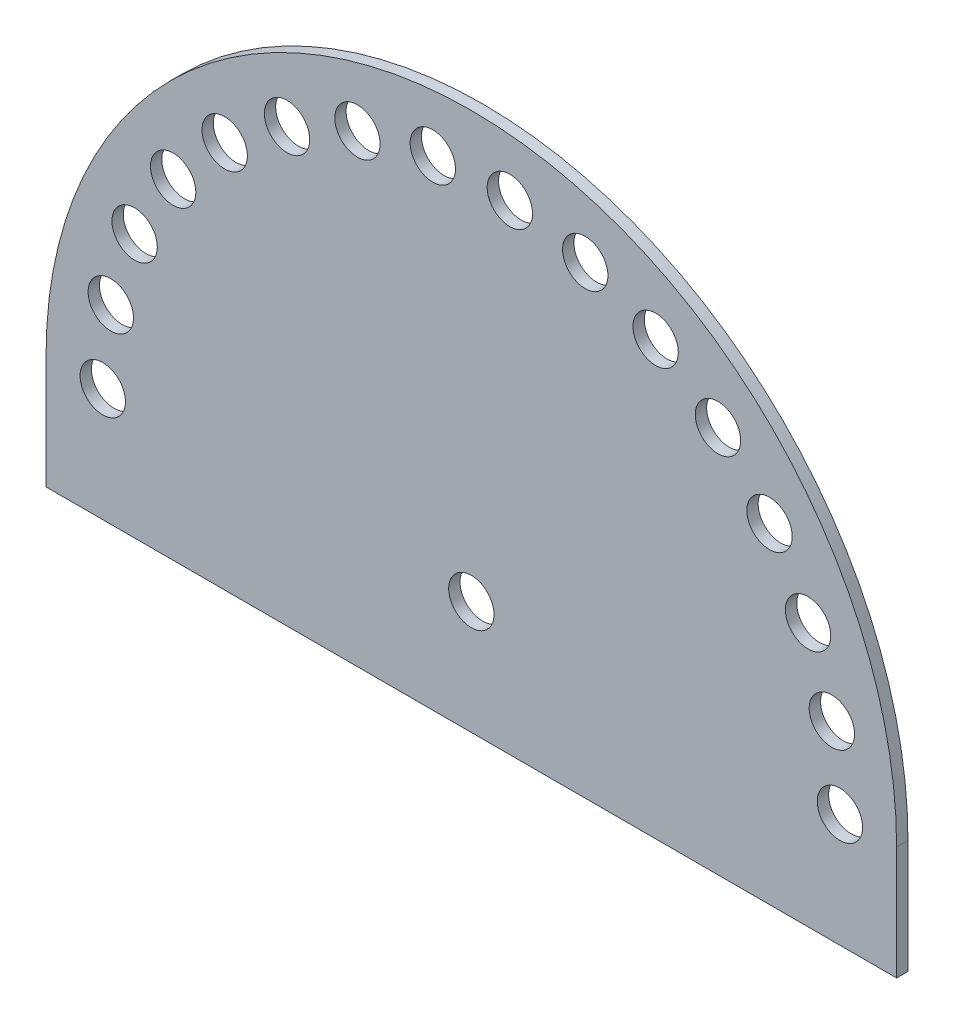
ISO-10303-21;
HEADER;
FILE_DESCRIPTION(('STEP AP214'),'2;1');
FILE_NAME('part.step','',(''),(''),'','','');
FILE_SCHEMA(('AUTOMOTIVE_DESIGN { 1 0 10303 214 1 1 1 1 }'));
ENDSEC;
DATA;
#1=APPLICATION_CONTEXT('core data for automotive mechanical design processes');
#2=APPLICATION_PROTOCOL_DEFINITION('international standard','automotive_design',2000,#1);
#3=PRODUCT_CONTEXT('',#1,'mechanical');
#4=PRODUCT('Part','Part','',(#3));
#5=PRODUCT_RELATED_PRODUCT_CATEGORY('part','',(#4));
#6=PRODUCT_DEFINITION_FORMATION('','',#4);
#7=PRODUCT_DEFINITION_CONTEXT('part definition',#1,'design');
#8=PRODUCT_DEFINITION('design','',#6,#7);
#9=PRODUCT_DEFINITION_SHAPE('','',#8);
#10=(LENGTH_UNIT() NAMED_UNIT(*) SI_UNIT(.MILLI.,.METRE.));
#11=(NAMED_UNIT(*) PLANE_ANGLE_UNIT() SI_UNIT($,.RADIAN.));
#12=(NAMED_UNIT(*) SI_UNIT($,.STERADIAN.) SOLID_ANGLE_UNIT());
#13=UNCERTAINTY_MEASURE_WITH_UNIT(LENGTH_MEASURE(1.E-05),#10,'distance_accuracy_value','');
#14=(GEOMETRIC_REPRESENTATION_CONTEXT(3) GLOBAL_UNCERTAINTY_ASSIGNED_CONTEXT((#13)) GLOBAL_UNIT_ASSIGNED_CONTEXT((#10,
#11,#12)) REPRESENTATION_CONTEXT('',''));
#15=CARTESIAN_POINT('',(0.,0.,0.));
#16=DIRECTION('',(0.,0.,1.));
#17=DIRECTION('',(1.,0.,0.));
#18=AXIS2_PLACEMENT_3D('',#15,#16,#17);
#19=CARTESIAN_POINT('',(0.,0.,2.));
#20=DIRECTION('',(0.,0.,1.));
#21=DIRECTION('',(1.,0.,0.));
#22=AXIS2_PLACEMENT_3D('',#19,#20,#21);
#23=PLANE('',#22);
#24=CARTESIAN_POINT('',(63.5795940476974,13.514259903154,2.));
#25=DIRECTION('',(0.,0.,1.));
#26=DIRECTION('',(1.,0.,0.));
#27=AXIS2_PLACEMENT_3D('',#24,#25,#26);
#28=CIRCLE('',#27,4.);
#29=CARTESIAN_POINT('',(67.5795940476974,13.514259903154,2.));
#30=VERTEX_POINT('',#29);
#31=EDGE_CURVE('E246',#30,#30,#28,.T.);
#32=ORIENTED_EDGE('',*,*,#31,.F.);
#33=EDGE_LOOP('',(#32));
#34=FACE_BOUND('',#33,.T.);
#35=CARTESIAN_POINT('',(52.5861046343718,38.2060413990105,2.));
#36=DIRECTION('',(0.,0.,1.));
#37=DIRECTION('',(1.,0.,0.));
#38=AXIS2_PLACEMENT_3D('',#35,#36,#37);
#39=CIRCLE('',#38,4.);
#40=CARTESIAN_POINT('',(56.5861046343718,38.2060413990105,2.));
#41=VERTEX_POINT('',#40);
#42=EDGE_CURVE('E230',#41,#41,#39,.T.);
#43=ORIENTED_EDGE('',*,*,#42,.F.);
#44=EDGE_LOOP('',(#43));
#45=FACE_BOUND('',#44,.T.);
#46=CARTESIAN_POINT('',(32.5000000000003,56.2916512459884,2.));
#47=DIRECTION('',(0.,0.,1.));
#48=DIRECTION('',(1.,0.,0.));
#49=AXIS2_PLACEMENT_3D('',#46,#47,#48);
#50=CIRCLE('',#49,4.00000000000001);
#51=CARTESIAN_POINT('',(36.5000000000003,56.2916512459884,2.));
#52=VERTEX_POINT('',#51);
#53=EDGE_CURVE('E214',#52,#52,#50,.T.);
#54=ORIENTED_EDGE('',*,*,#53,.F.);
#55=EDGE_LOOP('',(#54));
#56=FACE_BOUND('',#55,.T.);
#57=CARTESIAN_POINT('',(6.79435011239771,64.6439231989377,2.));
#58=DIRECTION('',(0.,0.,1.));
#59=DIRECTION('',(1.,0.,0.));
#60=AXIS2_PLACEMENT_3D('',#57,#58,#59);
#61=CIRCLE('',#60,4.00000000000001);
#62=CARTESIAN_POINT('',(10.7943501123977,64.6439231989377,2.));
#63=VERTEX_POINT('',#62);
#64=EDGE_CURVE('E198',#63,#63,#61,.T.);
#65=ORIENTED_EDGE('',*,*,#64,.F.);
#66=EDGE_LOOP('',(#65));
#67=FACE_BOUND('',#66,.T.);
#68=CARTESIAN_POINT('',(-20.0861046343714,61.818673559185,2.));
#69=DIRECTION('',(0.,0.,1.));
#70=DIRECTION('',(1.,0.,0.));
#71=AXIS2_PLACEMENT_3D('',#68,#69,#70);
#72=CIRCLE('',#71,4.);
#73=CARTESIAN_POINT('',(-16.0861046343714,61.818673559185,2.));
#74=VERTEX_POINT('',#73);
#75=EDGE_CURVE('E182',#74,#74,#72,.T.);
#76=ORIENTED_EDGE('',*,*,#75,.F.);
#77=EDGE_LOOP('',(#76));
#78=FACE_BOUND('',#77,.T.);
#79=CARTESIAN_POINT('',(-43.4934894133257,48.3044136560307,2.));
#80=DIRECTION('',(0.,0.,1.));
#81=DIRECTION('',(1.,0.,0.));
#82=AXIS2_PLACEMENT_3D('',#79,#80,#81);
#83=CIRCLE('',#82,4.00000000000001);
#84=CARTESIAN_POINT('',(-39.4934894133257,48.3044136560307,2.));
#85=VERTEX_POINT('',#84);
#86=EDGE_CURVE('E166',#85,#85,#83,.T.);
#87=ORIENTED_EDGE('',*,*,#86,.F.);
#88=EDGE_LOOP('',(#87));
#89=FACE_BOUND('',#88,.T.);
#90=CARTESIAN_POINT('',(-59.380454746769,26.4378817999271,2.));
#91=DIRECTION('',(0.,0.,1.));
#92=DIRECTION('',(1.,0.,0.));
#93=AXIS2_PLACEMENT_3D('',#90,#91,#92);
#94=CIRCLE('',#93,4.);
#95=CARTESIAN_POINT('',(-55.380454746769,26.4378817999271,2.));
#96=VERTEX_POINT('',#95);
#97=EDGE_CURVE('E150',#96,#96,#94,.T.);
#98=ORIENTED_EDGE('',*,*,#97,.F.);
#99=EDGE_LOOP('',(#98));
#100=FACE_BOUND('',#99,.T.);
#101=CARTESIAN_POINT('',(0.,0.,2.));
#102=DIRECTION('',(0.,0.,1.));
#103=DIRECTION('',(1.,0.,0.));
#104=AXIS2_PLACEMENT_3D('',#101,#102,#103);
#105=CIRCLE('',#104,4.);
#106=CARTESIAN_POINT('',(4.,0.,2.));
#107=VERTEX_POINT('',#106);
#108=EDGE_CURVE('E134',#107,#107,#105,.T.);
#109=ORIENTED_EDGE('',*,*,#108,.F.);
#110=EDGE_LOOP('',(#109));
#111=FACE_BOUND('',#110,.T.);
#112=DIRECTION('',(1.,0.,0.));
#113=VECTOR('',#112,1.);
#114=CARTESIAN_POINT('',(-75.,-20.,2.));
#115=LINE('',#114,#113);
#116=CARTESIAN_POINT('',(-75.,-20.,2.));
#117=VERTEX_POINT('',#116);
#118=CARTESIAN_POINT('',(75.,-20.,2.));
#119=VERTEX_POINT('',#118);
#120=EDGE_CURVE('E92',#117,#119,#115,.T.);
#121=ORIENTED_EDGE('',*,*,#120,.T.);
#122=DIRECTION('',(0.,1.,0.));
#123=VECTOR('',#122,1.);
#124=CARTESIAN_POINT('',(75.,-20.,2.));
#125=LINE('',#124,#123);
#126=CARTESIAN_POINT('',(75.,0.,2.));
#127=VERTEX_POINT('',#126);
#128=EDGE_CURVE('E87',#119,#127,#125,.T.);
#129=ORIENTED_EDGE('',*,*,#128,.T.);
#130=CARTESIAN_POINT('',(0.,0.,2.));
#131=DIRECTION('',(0.,0.,1.));
#132=DIRECTION('',(1.,0.,0.));
#133=AXIS2_PLACEMENT_3D('',#130,#131,#132);
#134=CIRCLE('',#133,75.);
#135=CARTESIAN_POINT('',(-75.,0.,2.));
#136=VERTEX_POINT('',#135);
#137=EDGE_CURVE('E90',#127,#136,#134,.T.);
#138=ORIENTED_EDGE('',*,*,#137,.T.);
#139=DIRECTION('',(0.,-1.,0.));
#140=VECTOR('',#139,1.);
#141=CARTESIAN_POINT('',(-75.,0.,2.));
#142=LINE('',#141,#140);
#143=EDGE_CURVE('E57',#136,#117,#142,.T.);
#144=ORIENTED_EDGE('',*,*,#143,.T.);
#145=EDGE_LOOP('',(#121,#129,#138,#144));
#146=FACE_BOUND('',#145,.T.);
#147=CARTESIAN_POINT('',(-65.,0.,2.));
#148=DIRECTION('',(0.,0.,1.));
#149=DIRECTION('',(1.,0.,0.));
#150=AXIS2_PLACEMENT_3D('',#147,#148,#149);
#151=CIRCLE('',#150,4.00000000000001);
#152=CARTESIAN_POINT('',(-61.,0.,2.));
#153=VERTEX_POINT('',#152);
#154=EDGE_CURVE('E112',#153,#153,#151,.T.);
#155=ORIENTED_EDGE('',*,*,#154,.F.);
#156=EDGE_LOOP('',(#155));
#157=FACE_BOUND('',#156,.T.);
#158=CARTESIAN_POINT('',(-63.5795940476974,13.5142599031544,2.));
#159=DIRECTION('',(0.,0.,1.));
#160=DIRECTION('',(1.,0.,0.));
#161=AXIS2_PLACEMENT_3D('',#158,#159,#160);
#162=CIRCLE('',#161,4.00000000000001);
#163=CARTESIAN_POINT('',(-59.5795940476974,13.5142599031544,2.));
#164=VERTEX_POINT('',#163);
#165=EDGE_CURVE('E142',#164,#164,#162,.T.);
#166=ORIENTED_EDGE('',*,*,#165,.F.);
#167=EDGE_LOOP('',(#166));
#168=FACE_BOUND('',#167,.T.);
#169=CARTESIAN_POINT('',(-52.5861046343715,38.2060413990108,2.));
#170=DIRECTION('',(0.,0.,1.));
#171=DIRECTION('',(1.,0.,0.));
#172=AXIS2_PLACEMENT_3D('',#169,#170,#171);
#173=CIRCLE('',#172,4.);
#174=CARTESIAN_POINT('',(-48.5861046343715,38.2060413990108,2.));
#175=VERTEX_POINT('',#174);
#176=EDGE_CURVE('E158',#175,#175,#173,.T.);
#177=ORIENTED_EDGE('',*,*,#176,.F.);
#178=EDGE_LOOP('',(#177));
#179=FACE_BOUND('',#178,.T.);
#180=CARTESIAN_POINT('',(-32.4999999999999,56.2916512459886,2.));
#181=DIRECTION('',(0.,0.,1.));
#182=DIRECTION('',(1.,0.,0.));
#183=AXIS2_PLACEMENT_3D('',#180,#181,#182);
#184=CIRCLE('',#183,4.);
#185=CARTESIAN_POINT('',(-28.4999999999999,56.2916512459886,2.));
#186=VERTEX_POINT('',#185);
#187=EDGE_CURVE('E174',#186,#186,#184,.T.);
#188=ORIENTED_EDGE('',*,*,#187,.F.);
#189=EDGE_LOOP('',(#188));
#190=FACE_BOUND('',#189,.T.);
#191=CARTESIAN_POINT('',(-6.79435011239728,64.6439231989378,2.));
#192=DIRECTION('',(0.,0.,1.));
#193=DIRECTION('',(1.,0.,0.));
#194=AXIS2_PLACEMENT_3D('',#191,#192,#193);
#195=CIRCLE('',#194,4.00000000000001);
#196=CARTESIAN_POINT('',(-2.79435011239727,64.6439231989378,2.));
#197=VERTEX_POINT('',#196);
#198=EDGE_CURVE('E190',#197,#197,#195,.T.);
#199=ORIENTED_EDGE('',*,*,#198,.F.);
#200=EDGE_LOOP('',(#199));
#201=FACE_BOUND('',#200,.T.);
#202=CARTESIAN_POINT('',(20.0861046343718,61.8186735591849,2.));
#203=DIRECTION('',(0.,0.,1.));
#204=DIRECTION('',(1.,0.,0.));
#205=AXIS2_PLACEMENT_3D('',#202,#203,#204);
#206=CIRCLE('',#205,4.00000000000001);
#207=CARTESIAN_POINT('',(24.0861046343718,61.8186735591849,2.));
#208=VERTEX_POINT('',#207);
#209=EDGE_CURVE('E206',#208,#208,#206,.T.);
#210=ORIENTED_EDGE('',*,*,#209,.F.);
#211=EDGE_LOOP('',(#210));
#212=FACE_BOUND('',#211,.T.);
#213=CARTESIAN_POINT('',(43.493489413326,48.3044136560304,2.));
#214=DIRECTION('',(0.,0.,1.));
#215=DIRECTION('',(1.,0.,0.));
#216=AXIS2_PLACEMENT_3D('',#213,#214,#215);
#217=CIRCLE('',#216,4.00000000000001);
#218=CARTESIAN_POINT('',(47.493489413326,48.3044136560304,2.));
#219=VERTEX_POINT('',#218);
#220=EDGE_CURVE('E222',#219,#219,#217,.T.);
#221=ORIENTED_EDGE('',*,*,#220,.F.);
#222=EDGE_LOOP('',(#221));
#223=FACE_BOUND('',#222,.T.);
#224=CARTESIAN_POINT('',(59.3804547467692,26.4378817999267,2.));
#225=DIRECTION('',(0.,0.,1.));
#226=DIRECTION('',(1.,0.,0.));
#227=AXIS2_PLACEMENT_3D('',#224,#225,#226);
#228=CIRCLE('',#227,4.);
#229=CARTESIAN_POINT('',(63.3804547467692,26.4378817999267,2.));
#230=VERTEX_POINT('',#229);
#231=EDGE_CURVE('E238',#230,#230,#228,.T.);
#232=ORIENTED_EDGE('',*,*,#231,.F.);
#233=EDGE_LOOP('',(#232));
#234=FACE_BOUND('',#233,.T.);
#235=CARTESIAN_POINT('',(65.,-4.53892574049607E-13,2.));
#236=DIRECTION('',(0.,0.,1.));
#237=DIRECTION('',(1.,0.,0.));
#238=AXIS2_PLACEMENT_3D('',#235,#236,#237);
#239=CIRCLE('',#238,4.00000000000001);
#240=CARTESIAN_POINT('',(69.,-4.53892574049607E-13,2.));
#241=VERTEX_POINT('',#240);
#242=EDGE_CURVE('E254',#241,#241,#239,.T.);
#243=ORIENTED_EDGE('',*,*,#242,.F.);
#244=EDGE_LOOP('',(#243));
#245=FACE_BOUND('',#244,.T.);
#246=ADVANCED_FACE('F39',(#34,#45,#56,#67,#78,#89,#100,#111,#146,#157,#168,#179,#190,#201,#212,
#223,#234,#245),#23,.T.);
#247=CARTESIAN_POINT('',(0.,0.,0.));
#248=DIRECTION('',(0.,0.,1.));
#249=DIRECTION('',(1.,0.,0.));
#250=AXIS2_PLACEMENT_3D('',#247,#248,#249);
#251=PLANE('',#250);
#252=DIRECTION('',(1.,0.,0.));
#253=VECTOR('',#252,1.);
#254=CARTESIAN_POINT('',(-75.,-20.,0.));
#255=LINE('',#254,#253);
#256=CARTESIAN_POINT('',(-75.,-20.,0.));
#257=VERTEX_POINT('',#256);
#258=CARTESIAN_POINT('',(75.,-20.,0.));
#259=VERTEX_POINT('',#258);
#260=EDGE_CURVE('E108',#257,#259,#255,.T.);
#261=ORIENTED_EDGE('',*,*,#260,.F.);
#262=DIRECTION('',(0.,-1.,0.));
#263=VECTOR('',#262,1.);
#264=CARTESIAN_POINT('',(-75.,0.,0.));
#265=LINE('',#264,#263);
#266=CARTESIAN_POINT('',(-75.,0.,0.));
#267=VERTEX_POINT('',#266);
#268=EDGE_CURVE('E80',#267,#257,#265,.T.);
#269=ORIENTED_EDGE('',*,*,#268,.F.);
#270=CARTESIAN_POINT('',(0.,0.,0.));
#271=DIRECTION('',(0.,0.,1.));
#272=DIRECTION('',(1.,0.,0.));
#273=AXIS2_PLACEMENT_3D('',#270,#271,#272);
#274=CIRCLE('',#273,75.);
#275=CARTESIAN_POINT('',(75.,0.,0.));
#276=VERTEX_POINT('',#275);
#277=EDGE_CURVE('E74',#276,#267,#274,.T.);
#278=ORIENTED_EDGE('',*,*,#277,.F.);
#279=DIRECTION('',(0.,1.,0.));
#280=VECTOR('',#279,1.);
#281=CARTESIAN_POINT('',(75.,-20.,0.));
#282=LINE('',#281,#280);
#283=EDGE_CURVE('E97',#259,#276,#282,.T.);
#284=ORIENTED_EDGE('',*,*,#283,.F.);
#285=EDGE_LOOP('',(#261,#269,#278,#284));
#286=FACE_BOUND('',#285,.T.);
#287=CARTESIAN_POINT('',(-65.,0.,0.));
#288=DIRECTION('',(0.,0.,1.));
#289=DIRECTION('',(1.,0.,0.));
#290=AXIS2_PLACEMENT_3D('',#287,#288,#289);
#291=CIRCLE('',#290,4.00000000000001);
#292=CARTESIAN_POINT('',(-61.,0.,0.));
#293=VERTEX_POINT('',#292);
#294=EDGE_CURVE('E130',#293,#293,#291,.T.);
#295=ORIENTED_EDGE('',*,*,#294,.T.);
#296=EDGE_LOOP('',(#295));
#297=FACE_BOUND('',#296,.T.);
#298=CARTESIAN_POINT('',(0.,0.,0.));
#299=DIRECTION('',(0.,0.,1.));
#300=DIRECTION('',(1.,0.,0.));
#301=AXIS2_PLACEMENT_3D('',#298,#299,#300);
#302=CIRCLE('',#301,4.);
#303=CARTESIAN_POINT('',(4.,0.,0.));
#304=VERTEX_POINT('',#303);
#305=EDGE_CURVE('E138',#304,#304,#302,.T.);
#306=ORIENTED_EDGE('',*,*,#305,.T.);
#307=EDGE_LOOP('',(#306));
#308=FACE_BOUND('',#307,.T.);
#309=CARTESIAN_POINT('',(-63.5795940476974,13.5142599031544,0.));
#310=DIRECTION('',(0.,0.,1.));
#311=DIRECTION('',(1.,0.,0.));
#312=AXIS2_PLACEMENT_3D('',#309,#310,#311);
#313=CIRCLE('',#312,4.00000000000001);
#314=CARTESIAN_POINT('',(-59.5795940476974,13.5142599031544,0.));
#315=VERTEX_POINT('',#314);
#316=EDGE_CURVE('E146',#315,#315,#313,.T.);
#317=ORIENTED_EDGE('',*,*,#316,.T.);
#318=EDGE_LOOP('',(#317));
#319=FACE_BOUND('',#318,.T.);
#320=CARTESIAN_POINT('',(-59.380454746769,26.4378817999271,0.));
#321=DIRECTION('',(0.,0.,1.));
#322=DIRECTION('',(1.,0.,0.));
#323=AXIS2_PLACEMENT_3D('',#320,#321,#322);
#324=CIRCLE('',#323,4.);
#325=CARTESIAN_POINT('',(-55.380454746769,26.4378817999271,0.));
#326=VERTEX_POINT('',#325);
#327=EDGE_CURVE('E154',#326,#326,#324,.T.);
#328=ORIENTED_EDGE('',*,*,#327,.T.);
#329=EDGE_LOOP('',(#328));
#330=FACE_BOUND('',#329,.T.);
#331=CARTESIAN_POINT('',(-52.5861046343715,38.2060413990108,0.));
#332=DIRECTION('',(0.,0.,1.));
#333=DIRECTION('',(1.,0.,0.));
#334=AXIS2_PLACEMENT_3D('',#331,#332,#333);
#335=CIRCLE('',#334,4.);
#336=CARTESIAN_POINT('',(-48.5861046343715,38.2060413990108,0.));
#337=VERTEX_POINT('',#336);
#338=EDGE_CURVE('E162',#337,#337,#335,.T.);
#339=ORIENTED_EDGE('',*,*,#338,.T.);
#340=EDGE_LOOP('',(#339));
#341=FACE_BOUND('',#340,.T.);
#342=CARTESIAN_POINT('',(-43.4934894133257,48.3044136560307,0.));
#343=DIRECTION('',(0.,0.,1.));
#344=DIRECTION('',(1.,0.,0.));
#345=AXIS2_PLACEMENT_3D('',#342,#343,#344);
#346=CIRCLE('',#345,4.00000000000001);
#347=CARTESIAN_POINT('',(-39.4934894133257,48.3044136560307,0.));
#348=VERTEX_POINT('',#347);
#349=EDGE_CURVE('E170',#348,#348,#346,.T.);
#350=ORIENTED_EDGE('',*,*,#349,.T.);
#351=EDGE_LOOP('',(#350));
#352=FACE_BOUND('',#351,.T.);
#353=CARTESIAN_POINT('',(-32.4999999999999,56.2916512459886,0.));
#354=DIRECTION('',(0.,0.,1.));
#355=DIRECTION('',(1.,0.,0.));
#356=AXIS2_PLACEMENT_3D('',#353,#354,#355);
#357=CIRCLE('',#356,4.);
#358=CARTESIAN_POINT('',(-28.4999999999999,56.2916512459886,0.));
#359=VERTEX_POINT('',#358);
#360=EDGE_CURVE('E178',#359,#359,#357,.T.);
#361=ORIENTED_EDGE('',*,*,#360,.T.);
#362=EDGE_LOOP('',(#361));
#363=FACE_BOUND('',#362,.T.);
#364=CARTESIAN_POINT('',(-20.0861046343714,61.818673559185,0.));
#365=DIRECTION('',(0.,0.,1.));
#366=DIRECTION('',(1.,0.,0.));
#367=AXIS2_PLACEMENT_3D('',#364,#365,#366);
#368=CIRCLE('',#367,4.);
#369=CARTESIAN_POINT('',(-16.0861046343714,61.818673559185,0.));
#370=VERTEX_POINT('',#369);
#371=EDGE_CURVE('E186',#370,#370,#368,.T.);
#372=ORIENTED_EDGE('',*,*,#371,.T.);
#373=EDGE_LOOP('',(#372));
#374=FACE_BOUND('',#373,.T.);
#375=CARTESIAN_POINT('',(-6.79435011239728,64.6439231989378,0.));
#376=DIRECTION('',(0.,0.,1.));
#377=DIRECTION('',(1.,0.,0.));
#378=AXIS2_PLACEMENT_3D('',#375,#376,#377);
#379=CIRCLE('',#378,4.00000000000001);
#380=CARTESIAN_POINT('',(-2.79435011239727,64.6439231989378,0.));
#381=VERTEX_POINT('',#380);
#382=EDGE_CURVE('E194',#381,#381,#379,.T.);
#383=ORIENTED_EDGE('',*,*,#382,.T.);
#384=EDGE_LOOP('',(#383));
#385=FACE_BOUND('',#384,.T.);
#386=CARTESIAN_POINT('',(6.79435011239771,64.6439231989377,0.));
#387=DIRECTION('',(0.,0.,1.));
#388=DIRECTION('',(1.,0.,0.));
#389=AXIS2_PLACEMENT_3D('',#386,#387,#388);
#390=CIRCLE('',#389,4.00000000000001);
#391=CARTESIAN_POINT('',(10.7943501123977,64.6439231989377,0.));
#392=VERTEX_POINT('',#391);
#393=EDGE_CURVE('E202',#392,#392,#390,.T.);
#394=ORIENTED_EDGE('',*,*,#393,.T.);
#395=EDGE_LOOP('',(#394));
#396=FACE_BOUND('',#395,.T.);
#397=CARTESIAN_POINT('',(20.0861046343718,61.8186735591849,0.));
#398=DIRECTION('',(0.,0.,1.));
#399=DIRECTION('',(1.,0.,0.));
#400=AXIS2_PLACEMENT_3D('',#397,#398,#399);
#401=CIRCLE('',#400,4.00000000000001);
#402=CARTESIAN_POINT('',(24.0861046343718,61.8186735591849,0.));
#403=VERTEX_POINT('',#402);
#404=EDGE_CURVE('E210',#403,#403,#401,.T.);
#405=ORIENTED_EDGE('',*,*,#404,.T.);
#406=EDGE_LOOP('',(#405));
#407=FACE_BOUND('',#406,.T.);
#408=CARTESIAN_POINT('',(32.5000000000003,56.2916512459884,0.));
#409=DIRECTION('',(0.,0.,1.));
#410=DIRECTION('',(1.,0.,0.));
#411=AXIS2_PLACEMENT_3D('',#408,#409,#410);
#412=CIRCLE('',#411,4.00000000000001);
#413=CARTESIAN_POINT('',(36.5000000000003,56.2916512459884,0.));
#414=VERTEX_POINT('',#413);
#415=EDGE_CURVE('E218',#414,#414,#412,.T.);
#416=ORIENTED_EDGE('',*,*,#415,.T.);
#417=EDGE_LOOP('',(#416));
#418=FACE_BOUND('',#417,.T.);
#419=CARTESIAN_POINT('',(43.493489413326,48.3044136560304,0.));
#420=DIRECTION('',(0.,0.,1.));
#421=DIRECTION('',(1.,0.,0.));
#422=AXIS2_PLACEMENT_3D('',#419,#420,#421);
#423=CIRCLE('',#422,4.00000000000001);
#424=CARTESIAN_POINT('',(47.493489413326,48.3044136560304,0.));
#425=VERTEX_POINT('',#424);
#426=EDGE_CURVE('E226',#425,#425,#423,.T.);
#427=ORIENTED_EDGE('',*,*,#426,.T.);
#428=EDGE_LOOP('',(#427));
#429=FACE_BOUND('',#428,.T.);
#430=CARTESIAN_POINT('',(52.5861046343718,38.2060413990105,0.));
#431=DIRECTION('',(0.,0.,1.));
#432=DIRECTION('',(1.,0.,0.));
#433=AXIS2_PLACEMENT_3D('',#430,#431,#432);
#434=CIRCLE('',#433,4.);
#435=CARTESIAN_POINT('',(56.5861046343718,38.2060413990105,0.));
#436=VERTEX_POINT('',#435);
#437=EDGE_CURVE('E234',#436,#436,#434,.T.);
#438=ORIENTED_EDGE('',*,*,#437,.T.);
#439=EDGE_LOOP('',(#438));
#440=FACE_BOUND('',#439,.T.);
#441=CARTESIAN_POINT('',(59.3804547467692,26.4378817999267,0.));
#442=DIRECTION('',(0.,0.,1.));
#443=DIRECTION('',(1.,0.,0.));
#444=AXIS2_PLACEMENT_3D('',#441,#442,#443);
#445=CIRCLE('',#444,4.);
#446=CARTESIAN_POINT('',(63.3804547467692,26.4378817999267,0.));
#447=VERTEX_POINT('',#446);
#448=EDGE_CURVE('E242',#447,#447,#445,.T.);
#449=ORIENTED_EDGE('',*,*,#448,.T.);
#450=EDGE_LOOP('',(#449));
#451=FACE_BOUND('',#450,.T.);
#452=CARTESIAN_POINT('',(63.5795940476974,13.514259903154,0.));
#453=DIRECTION('',(0.,0.,1.));
#454=DIRECTION('',(1.,0.,0.));
#455=AXIS2_PLACEMENT_3D('',#452,#453,#454);
#456=CIRCLE('',#455,4.);
#457=CARTESIAN_POINT('',(67.5795940476974,13.514259903154,0.));
#458=VERTEX_POINT('',#457);
#459=EDGE_CURVE('E250',#458,#458,#456,.T.);
#460=ORIENTED_EDGE('',*,*,#459,.T.);
#461=EDGE_LOOP('',(#460));
#462=FACE_BOUND('',#461,.T.);
#463=CARTESIAN_POINT('',(65.,-4.53892574049607E-13,0.));
#464=DIRECTION('',(0.,0.,1.));
#465=DIRECTION('',(1.,0.,0.));
#466=AXIS2_PLACEMENT_3D('',#463,#464,#465);
#467=CIRCLE('',#466,4.00000000000001);
#468=CARTESIAN_POINT('',(69.,-4.53892574049607E-13,0.));
#469=VERTEX_POINT('',#468);
#470=EDGE_CURVE('E258',#469,#469,#467,.T.);
#471=ORIENTED_EDGE('',*,*,#470,.T.);
#472=EDGE_LOOP('',(#471));
#473=FACE_BOUND('',#472,.T.);
#474=ADVANCED_FACE('F125',(#286,#297,#308,#319,#330,#341,#352,#363,#374,#385,#396,#407,#418,
#429,#440,#451,#462,#473),#251,.F.);
#475=CARTESIAN_POINT('',(-75.,-20.,2.));
#476=DIRECTION('',(0.,1.,0.));
#477=DIRECTION('',(0.,0.,1.));
#478=AXIS2_PLACEMENT_3D('',#475,#476,#477);
#479=PLANE('',#478);
#480=ORIENTED_EDGE('',*,*,#260,.T.);
#481=DIRECTION('',(0.,0.,-1.));
#482=VECTOR('',#481,1.);
#483=CARTESIAN_POINT('',(75.,-20.,2.));
#484=LINE('',#483,#482);
#485=EDGE_CURVE('E11',#119,#259,#484,.T.);
#486=ORIENTED_EDGE('',*,*,#485,.F.);
#487=ORIENTED_EDGE('',*,*,#120,.F.);
#488=DIRECTION('',(0.,0.,-1.));
#489=VECTOR('',#488,1.);
#490=CARTESIAN_POINT('',(-75.,-20.,2.));
#491=LINE('',#490,#489);
#492=EDGE_CURVE('E104',#117,#257,#491,.T.);
#493=ORIENTED_EDGE('',*,*,#492,.T.);
#494=EDGE_LOOP('',(#480,#486,#487,#493));
#495=FACE_BOUND('',#494,.T.);
#496=ADVANCED_FACE('F41',(#495),#479,.F.);
#497=CARTESIAN_POINT('',(75.,-20.,2.));
#498=DIRECTION('',(-1.,0.,0.));
#499=DIRECTION('',(0.,0.,1.));
#500=AXIS2_PLACEMENT_3D('',#497,#498,#499);
#501=PLANE('',#500);
#502=ORIENTED_EDGE('',*,*,#283,.T.);
#503=DIRECTION('',(0.,0.,-1.));
#504=VECTOR('',#503,1.);
#505=CARTESIAN_POINT('',(75.,0.,2.));
#506=LINE('',#505,#504);
#507=EDGE_CURVE('E49',#127,#276,#506,.T.);
#508=ORIENTED_EDGE('',*,*,#507,.F.);
#509=ORIENTED_EDGE('',*,*,#128,.F.);
#510=ORIENTED_EDGE('',*,*,#485,.T.);
#511=EDGE_LOOP('',(#502,#508,#509,#510));
#512=FACE_BOUND('',#511,.T.);
#513=ADVANCED_FACE('F96',(#512),#501,.F.);
#514=CARTESIAN_POINT('',(0.,0.,2.));
#515=DIRECTION('',(0.,0.,-1.));
#516=DIRECTION('',(-1.,0.,0.));
#517=AXIS2_PLACEMENT_3D('',#514,#515,#516);
#518=CYLINDRICAL_SURFACE('',#517,75.);
#519=ORIENTED_EDGE('',*,*,#277,.T.);
#520=DIRECTION('',(0.,0.,-1.));
#521=VECTOR('',#520,1.);
#522=CARTESIAN_POINT('',(-75.,0.,2.));
#523=LINE('',#522,#521);
#524=EDGE_CURVE('E99',#136,#267,#523,.T.);
#525=ORIENTED_EDGE('',*,*,#524,.F.);
#526=ORIENTED_EDGE('',*,*,#137,.F.);
#527=ORIENTED_EDGE('',*,*,#507,.T.);
#528=EDGE_LOOP('',(#519,#525,#526,#527));
#529=FACE_BOUND('',#528,.T.);
#530=ADVANCED_FACE('F100',(#529),#518,.T.);
#531=CARTESIAN_POINT('',(-75.,0.,2.));
#532=DIRECTION('',(1.,0.,0.));
#533=DIRECTION('',(0.,0.,-1.));
#534=AXIS2_PLACEMENT_3D('',#531,#532,#533);
#535=PLANE('',#534);
#536=ORIENTED_EDGE('',*,*,#268,.T.);
#537=ORIENTED_EDGE('',*,*,#492,.F.);
#538=ORIENTED_EDGE('',*,*,#143,.F.);
#539=ORIENTED_EDGE('',*,*,#524,.T.);
#540=EDGE_LOOP('',(#536,#537,#538,#539));
#541=FACE_BOUND('',#540,.T.);
#542=ADVANCED_FACE('F122',(#541),#535,.F.);
#543=CARTESIAN_POINT('',(-65.,0.,2.));
#544=DIRECTION('',(0.,0.,-1.));
#545=DIRECTION('',(-1.,0.,0.));
#546=AXIS2_PLACEMENT_3D('',#543,#544,#545);
#547=CYLINDRICAL_SURFACE('',#546,4.00000000000001);
#548=ORIENTED_EDGE('',*,*,#154,.T.);
#549=EDGE_LOOP('',(#548));
#550=FACE_BOUND('',#549,.T.);
#551=ORIENTED_EDGE('',*,*,#294,.F.);
#552=EDGE_LOOP('',(#551));
#553=FACE_BOUND('',#552,.T.);
#554=ADVANCED_FACE('F279',(#550,#553),#547,.F.);
#555=CARTESIAN_POINT('',(0.,0.,2.));
#556=DIRECTION('',(0.,0.,-1.));
#557=DIRECTION('',(-1.,0.,0.));
#558=AXIS2_PLACEMENT_3D('',#555,#556,#557);
#559=CYLINDRICAL_SURFACE('',#558,4.);
#560=ORIENTED_EDGE('',*,*,#108,.T.);
#561=EDGE_LOOP('',(#560));
#562=FACE_BOUND('',#561,.T.);
#563=ORIENTED_EDGE('',*,*,#305,.F.);
#564=EDGE_LOOP('',(#563));
#565=FACE_BOUND('',#564,.T.);
#566=ADVANCED_FACE('F325',(#562,#565),#559,.F.);
#567=CARTESIAN_POINT('',(-63.5795940476974,13.5142599031544,2.));
#568=DIRECTION('',(0.,0.,-1.));
#569=DIRECTION('',(-1.,0.,0.));
#570=AXIS2_PLACEMENT_3D('',#567,#568,#569);
#571=CYLINDRICAL_SURFACE('',#570,4.00000000000001);
#572=ORIENTED_EDGE('',*,*,#165,.T.);
#573=EDGE_LOOP('',(#572));
#574=FACE_BOUND('',#573,.T.);
#575=ORIENTED_EDGE('',*,*,#316,.F.);
#576=EDGE_LOOP('',(#575));
#577=FACE_BOUND('',#576,.T.);
#578=ADVANCED_FACE('F333',(#574,#577),#571,.F.);
#579=CARTESIAN_POINT('',(-59.380454746769,26.4378817999271,2.));
#580=DIRECTION('',(0.,0.,-1.));
#581=DIRECTION('',(-1.,0.,0.));
#582=AXIS2_PLACEMENT_3D('',#579,#580,#581);
#583=CYLINDRICAL_SURFACE('',#582,4.);
#584=ORIENTED_EDGE('',*,*,#97,.T.);
#585=EDGE_LOOP('',(#584));
#586=FACE_BOUND('',#585,.T.);
#587=ORIENTED_EDGE('',*,*,#327,.F.);
#588=EDGE_LOOP('',(#587));
#589=FACE_BOUND('',#588,.T.);
#590=ADVANCED_FACE('F341',(#586,#589),#583,.F.);
#591=CARTESIAN_POINT('',(-52.5861046343715,38.2060413990108,2.));
#592=DIRECTION('',(0.,0.,-1.));
#593=DIRECTION('',(-1.,0.,0.));
#594=AXIS2_PLACEMENT_3D('',#591,#592,#593);
#595=CYLINDRICAL_SURFACE('',#594,4.);
#596=ORIENTED_EDGE('',*,*,#176,.T.);
#597=EDGE_LOOP('',(#596));
#598=FACE_BOUND('',#597,.T.);
#599=ORIENTED_EDGE('',*,*,#338,.F.);
#600=EDGE_LOOP('',(#599));
#601=FACE_BOUND('',#600,.T.);
#602=ADVANCED_FACE('F350',(#598,#601),#595,.F.);
#603=CARTESIAN_POINT('',(-43.4934894133257,48.3044136560307,2.));
#604=DIRECTION('',(0.,0.,-1.));
#605=DIRECTION('',(-1.,0.,0.));
#606=AXIS2_PLACEMENT_3D('',#603,#604,#605);
#607=CYLINDRICAL_SURFACE('',#606,4.00000000000001);
#608=ORIENTED_EDGE('',*,*,#86,.T.);
#609=EDGE_LOOP('',(#608));
#610=FACE_BOUND('',#609,.T.);
#611=ORIENTED_EDGE('',*,*,#349,.F.);
#612=EDGE_LOOP('',(#611));
#613=FACE_BOUND('',#612,.T.);
#614=ADVANCED_FACE('F359',(#610,#613),#607,.F.);
#615=CARTESIAN_POINT('',(-32.4999999999999,56.2916512459886,2.));
#616=DIRECTION('',(0.,0.,-1.));
#617=DIRECTION('',(-1.,0.,0.));
#618=AXIS2_PLACEMENT_3D('',#615,#616,#617);
#619=CYLINDRICAL_SURFACE('',#618,4.);
#620=ORIENTED_EDGE('',*,*,#187,.T.);
#621=EDGE_LOOP('',(#620));
#622=FACE_BOUND('',#621,.T.);
#623=ORIENTED_EDGE('',*,*,#360,.F.);
#624=EDGE_LOOP('',(#623));
#625=FACE_BOUND('',#624,.T.);
#626=ADVANCED_FACE('F368',(#622,#625),#619,.F.);
#627=CARTESIAN_POINT('',(-20.0861046343714,61.818673559185,2.));
#628=DIRECTION('',(0.,0.,-1.));
#629=DIRECTION('',(-1.,0.,0.));
#630=AXIS2_PLACEMENT_3D('',#627,#628,#629);
#631=CYLINDRICAL_SURFACE('',#630,4.);
#632=ORIENTED_EDGE('',*,*,#75,.T.);
#633=EDGE_LOOP('',(#632));
#634=FACE_BOUND('',#633,.T.);
#635=ORIENTED_EDGE('',*,*,#371,.F.);
#636=EDGE_LOOP('',(#635));
#637=FACE_BOUND('',#636,.T.);
#638=ADVANCED_FACE('F377',(#634,#637),#631,.F.);
#639=CARTESIAN_POINT('',(-6.79435011239728,64.6439231989378,2.));
#640=DIRECTION('',(0.,0.,-1.));
#641=DIRECTION('',(-1.,0.,0.));
#642=AXIS2_PLACEMENT_3D('',#639,#640,#641);
#643=CYLINDRICAL_SURFACE('',#642,4.00000000000001);
#644=ORIENTED_EDGE('',*,*,#198,.T.);
#645=EDGE_LOOP('',(#644));
#646=FACE_BOUND('',#645,.T.);
#647=ORIENTED_EDGE('',*,*,#382,.F.);
#648=EDGE_LOOP('',(#647));
#649=FACE_BOUND('',#648,.T.);
#650=ADVANCED_FACE('F386',(#646,#649),#643,.F.);
#651=CARTESIAN_POINT('',(6.79435011239771,64.6439231989377,2.));
#652=DIRECTION('',(0.,0.,-1.));
#653=DIRECTION('',(-1.,0.,0.));
#654=AXIS2_PLACEMENT_3D('',#651,#652,#653);
#655=CYLINDRICAL_SURFACE('',#654,4.00000000000001);
#656=ORIENTED_EDGE('',*,*,#64,.T.);
#657=EDGE_LOOP('',(#656));
#658=FACE_BOUND('',#657,.T.);
#659=ORIENTED_EDGE('',*,*,#393,.F.);
#660=EDGE_LOOP('',(#659));
#661=FACE_BOUND('',#660,.T.);
#662=ADVANCED_FACE('F395',(#658,#661),#655,.F.);
#663=CARTESIAN_POINT('',(20.0861046343718,61.8186735591849,2.));
#664=DIRECTION('',(0.,0.,-1.));
#665=DIRECTION('',(-1.,0.,0.));
#666=AXIS2_PLACEMENT_3D('',#663,#664,#665);
#667=CYLINDRICAL_SURFACE('',#666,4.00000000000001);
#668=ORIENTED_EDGE('',*,*,#209,.T.);
#669=EDGE_LOOP('',(#668));
#670=FACE_BOUND('',#669,.T.);
#671=ORIENTED_EDGE('',*,*,#404,.F.);
#672=EDGE_LOOP('',(#671));
#673=FACE_BOUND('',#672,.T.);
#674=ADVANCED_FACE('F404',(#670,#673),#667,.F.);
#675=CARTESIAN_POINT('',(32.5000000000003,56.2916512459884,2.));
#676=DIRECTION('',(0.,0.,-1.));
#677=DIRECTION('',(-1.,0.,0.));
#678=AXIS2_PLACEMENT_3D('',#675,#676,#677);
#679=CYLINDRICAL_SURFACE('',#678,4.00000000000001);
#680=ORIENTED_EDGE('',*,*,#53,.T.);
#681=EDGE_LOOP('',(#680));
#682=FACE_BOUND('',#681,.T.);
#683=ORIENTED_EDGE('',*,*,#415,.F.);
#684=EDGE_LOOP('',(#683));
#685=FACE_BOUND('',#684,.T.);
#686=ADVANCED_FACE('F413',(#682,#685),#679,.F.);
#687=CARTESIAN_POINT('',(43.493489413326,48.3044136560304,2.));
#688=DIRECTION('',(0.,0.,-1.));
#689=DIRECTION('',(-1.,0.,0.));
#690=AXIS2_PLACEMENT_3D('',#687,#688,#689);
#691=CYLINDRICAL_SURFACE('',#690,4.00000000000001);
#692=ORIENTED_EDGE('',*,*,#220,.T.);
#693=EDGE_LOOP('',(#692));
#694=FACE_BOUND('',#693,.T.);
#695=ORIENTED_EDGE('',*,*,#426,.F.);
#696=EDGE_LOOP('',(#695));
#697=FACE_BOUND('',#696,.T.);
#698=ADVANCED_FACE('F422',(#694,#697),#691,.F.);
#699=CARTESIAN_POINT('',(52.5861046343718,38.2060413990105,2.));
#700=DIRECTION('',(0.,0.,-1.));
#701=DIRECTION('',(-1.,0.,0.));
#702=AXIS2_PLACEMENT_3D('',#699,#700,#701);
#703=CYLINDRICAL_SURFACE('',#702,4.);
#704=ORIENTED_EDGE('',*,*,#42,.T.);
#705=EDGE_LOOP('',(#704));
#706=FACE_BOUND('',#705,.T.);
#707=ORIENTED_EDGE('',*,*,#437,.F.);
#708=EDGE_LOOP('',(#707));
#709=FACE_BOUND('',#708,.T.);
#710=ADVANCED_FACE('F431',(#706,#709),#703,.F.);
#711=CARTESIAN_POINT('',(59.3804547467692,26.4378817999267,2.));
#712=DIRECTION('',(0.,0.,-1.));
#713=DIRECTION('',(-1.,0.,0.));
#714=AXIS2_PLACEMENT_3D('',#711,#712,#713);
#715=CYLINDRICAL_SURFACE('',#714,4.);
#716=ORIENTED_EDGE('',*,*,#231,.T.);
#717=EDGE_LOOP('',(#716));
#718=FACE_BOUND('',#717,.T.);
#719=ORIENTED_EDGE('',*,*,#448,.F.);
#720=EDGE_LOOP('',(#719));
#721=FACE_BOUND('',#720,.T.);
#722=ADVANCED_FACE('F440',(#718,#721),#715,.F.);
#723=CARTESIAN_POINT('',(63.5795940476974,13.514259903154,2.));
#724=DIRECTION('',(0.,0.,-1.));
#725=DIRECTION('',(-1.,0.,0.));
#726=AXIS2_PLACEMENT_3D('',#723,#724,#725);
#727=CYLINDRICAL_SURFACE('',#726,4.);
#728=ORIENTED_EDGE('',*,*,#31,.T.);
#729=EDGE_LOOP('',(#728));
#730=FACE_BOUND('',#729,.T.);
#731=ORIENTED_EDGE('',*,*,#459,.F.);
#732=EDGE_LOOP('',(#731));
#733=FACE_BOUND('',#732,.T.);
#734=ADVANCED_FACE('F449',(#730,#733),#727,.F.);
#735=CARTESIAN_POINT('',(65.,-4.53892574049607E-13,2.));
#736=DIRECTION('',(0.,0.,-1.));
#737=DIRECTION('',(-1.,0.,0.));
#738=AXIS2_PLACEMENT_3D('',#735,#736,#737);
#739=CYLINDRICAL_SURFACE('',#738,4.00000000000001);
#740=ORIENTED_EDGE('',*,*,#242,.T.);
#741=EDGE_LOOP('',(#740));
#742=FACE_BOUND('',#741,.T.);
#743=ORIENTED_EDGE('',*,*,#470,.F.);
#744=EDGE_LOOP('',(#743));
#745=FACE_BOUND('',#744,.T.);
#746=ADVANCED_FACE('F266',(#742,#745),#739,.F.);
#747=CLOSED_SHELL('',(#246,#474,#496,#513,#530,#542,#554,#566,#578,#590,#602,#614,#626,#638,
#650,#662,#674,#686,#698,#710,#722,#734,#746));
#748=MANIFOLD_SOLID_BREP('B2',#747);
#749=ADVANCED_BREP_SHAPE_REPRESENTATION('',(#18,#748),#14);
#750=SHAPE_DEFINITION_REPRESENTATION(#9,#749);
ENDSEC;
END-ISO-10303-21;
